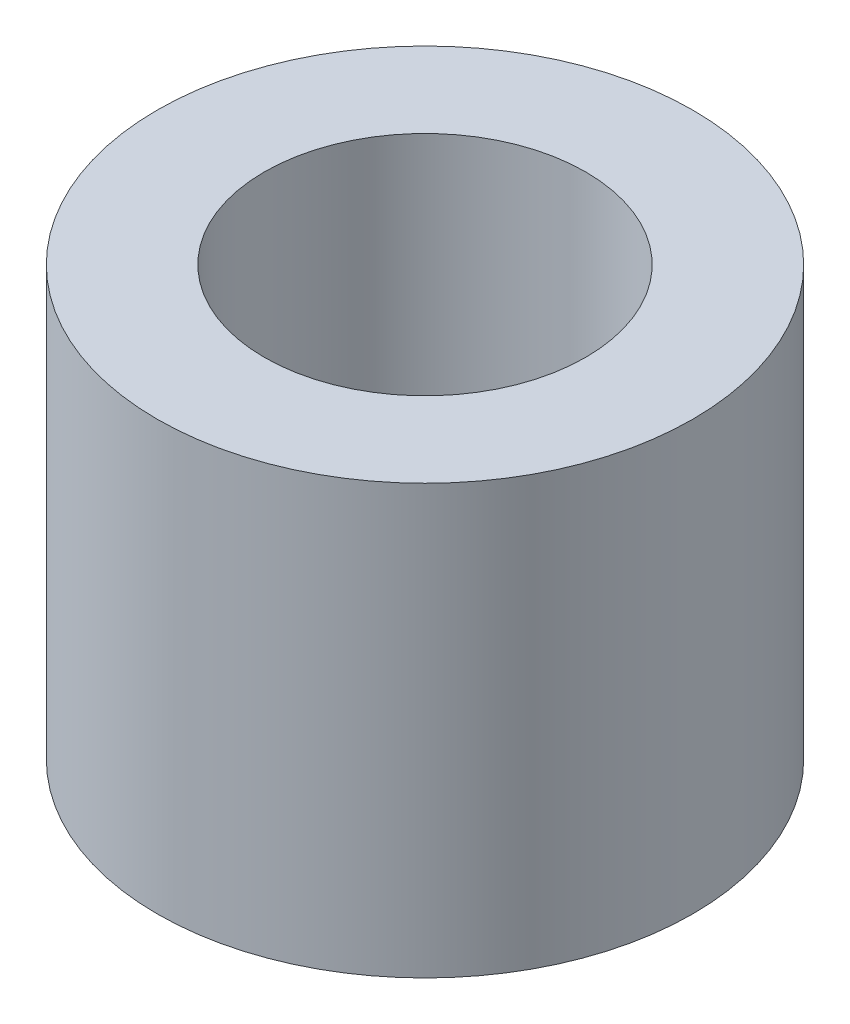
ISO-10303-21;
HEADER;
FILE_DESCRIPTION(('STEP AP214'),'2;1');
FILE_NAME('part.step','',(''),(''),'','','');
FILE_SCHEMA(('AUTOMOTIVE_DESIGN { 1 0 10303 214 1 1 1 1 }'));
ENDSEC;
DATA;
#1=APPLICATION_CONTEXT('core data for automotive mechanical design processes');
#2=APPLICATION_PROTOCOL_DEFINITION('international standard','automotive_design',2000,#1);
#3=PRODUCT_CONTEXT('',#1,'mechanical');
#4=PRODUCT('Part','Part','',(#3));
#5=PRODUCT_RELATED_PRODUCT_CATEGORY('part','',(#4));
#6=PRODUCT_DEFINITION_FORMATION('','',#4);
#7=PRODUCT_DEFINITION_CONTEXT('part definition',#1,'design');
#8=PRODUCT_DEFINITION('design','',#6,#7);
#9=PRODUCT_DEFINITION_SHAPE('','',#8);
#10=(LENGTH_UNIT() NAMED_UNIT(*) SI_UNIT(.MILLI.,.METRE.));
#11=(NAMED_UNIT(*) PLANE_ANGLE_UNIT() SI_UNIT($,.RADIAN.));
#12=(NAMED_UNIT(*) SI_UNIT($,.STERADIAN.) SOLID_ANGLE_UNIT());
#13=UNCERTAINTY_MEASURE_WITH_UNIT(LENGTH_MEASURE(1.E-05),#10,'distance_accuracy_value','');
#14=(GEOMETRIC_REPRESENTATION_CONTEXT(3) GLOBAL_UNCERTAINTY_ASSIGNED_CONTEXT((#13)) GLOBAL_UNIT_ASSIGNED_CONTEXT((#10,
#11,#12)) REPRESENTATION_CONTEXT('',''));
#15=CARTESIAN_POINT('',(0.,0.,0.));
#16=DIRECTION('',(0.,0.,1.));
#17=DIRECTION('',(1.,0.,0.));
#18=AXIS2_PLACEMENT_3D('',#15,#16,#17);
#19=CARTESIAN_POINT('',(0.,4.,0.));
#20=DIRECTION('',(0.,1.,0.));
#21=DIRECTION('',(0.,0.,1.));
#22=AXIS2_PLACEMENT_3D('',#19,#20,#21);
#23=PLANE('',#22);
#24=CARTESIAN_POINT('',(0.,4.,0.));
#25=DIRECTION('',(0.,1.,0.));
#26=DIRECTION('',(0.,0.,1.));
#27=AXIS2_PLACEMENT_3D('',#24,#25,#26);
#28=CIRCLE('',#27,2.5);
#29=CARTESIAN_POINT('',(0.,4.,2.5));
#30=VERTEX_POINT('',#29);
#31=EDGE_CURVE('E10',#30,#30,#28,.T.);
#32=ORIENTED_EDGE('',*,*,#31,.T.);
#33=EDGE_LOOP('',(#32));
#34=FACE_BOUND('',#33,.T.);
#35=CARTESIAN_POINT('',(0.,4.,0.));
#36=DIRECTION('',(0.,1.,0.));
#37=DIRECTION('',(0.,0.,1.));
#38=AXIS2_PLACEMENT_3D('',#35,#36,#37);
#39=CIRCLE('',#38,1.5);
#40=CARTESIAN_POINT('',(0.,4.,1.5));
#41=VERTEX_POINT('',#40);
#42=EDGE_CURVE('E46',#41,#41,#39,.T.);
#43=ORIENTED_EDGE('',*,*,#42,.F.);
#44=EDGE_LOOP('',(#43));
#45=FACE_BOUND('',#44,.T.);
#46=ADVANCED_FACE('F35',(#34,#45),#23,.T.);
#47=CARTESIAN_POINT('',(0.,0.,0.));
#48=DIRECTION('',(0.,1.,0.));
#49=DIRECTION('',(0.,0.,1.));
#50=AXIS2_PLACEMENT_3D('',#47,#48,#49);
#51=PLANE('',#50);
#52=CARTESIAN_POINT('',(0.,0.,0.));
#53=DIRECTION('',(0.,1.,0.));
#54=DIRECTION('',(0.,0.,1.));
#55=AXIS2_PLACEMENT_3D('',#52,#53,#54);
#56=CIRCLE('',#55,2.5);
#57=CARTESIAN_POINT('',(0.,0.,2.5));
#58=VERTEX_POINT('',#57);
#59=EDGE_CURVE('E39',#58,#58,#56,.T.);
#60=ORIENTED_EDGE('',*,*,#59,.F.);
#61=EDGE_LOOP('',(#60));
#62=FACE_BOUND('',#61,.T.);
#63=CARTESIAN_POINT('',(0.,0.,0.));
#64=DIRECTION('',(0.,1.,0.));
#65=DIRECTION('',(0.,0.,1.));
#66=AXIS2_PLACEMENT_3D('',#63,#64,#65);
#67=CIRCLE('',#66,1.5);
#68=CARTESIAN_POINT('',(0.,0.,1.5));
#69=VERTEX_POINT('',#68);
#70=EDGE_CURVE('E48',#69,#69,#67,.T.);
#71=ORIENTED_EDGE('',*,*,#70,.T.);
#72=EDGE_LOOP('',(#71));
#73=FACE_BOUND('',#72,.T.);
#74=ADVANCED_FACE('F58',(#62,#73),#51,.F.);
#75=CARTESIAN_POINT('',(0.,4.,0.));
#76=DIRECTION('',(0.,-1.,0.));
#77=DIRECTION('',(0.,0.,-1.));
#78=AXIS2_PLACEMENT_3D('',#75,#76,#77);
#79=CYLINDRICAL_SURFACE('',#78,2.5);
#80=ORIENTED_EDGE('',*,*,#31,.F.);
#81=EDGE_LOOP('',(#80));
#82=FACE_BOUND('',#81,.T.);
#83=ORIENTED_EDGE('',*,*,#59,.T.);
#84=EDGE_LOOP('',(#83));
#85=FACE_BOUND('',#84,.T.);
#86=ADVANCED_FACE('F37',(#82,#85),#79,.T.);
#87=CARTESIAN_POINT('',(0.,4.,0.));
#88=DIRECTION('',(0.,-1.,0.));
#89=DIRECTION('',(0.,0.,-1.));
#90=AXIS2_PLACEMENT_3D('',#87,#88,#89);
#91=CYLINDRICAL_SURFACE('',#90,1.5);
#92=ORIENTED_EDGE('',*,*,#42,.T.);
#93=EDGE_LOOP('',(#92));
#94=FACE_BOUND('',#93,.T.);
#95=ORIENTED_EDGE('',*,*,#70,.F.);
#96=EDGE_LOOP('',(#95));
#97=FACE_BOUND('',#96,.T.);
#98=ADVANCED_FACE('F54',(#94,#97),#91,.F.);
#99=CLOSED_SHELL('',(#46,#74,#86,#98));
#100=MANIFOLD_SOLID_BREP('B2',#99);
#101=ADVANCED_BREP_SHAPE_REPRESENTATION('',(#18,#100),#14);
#102=SHAPE_DEFINITION_REPRESENTATION(#9,#101);
ENDSEC;
END-ISO-10303-21;
